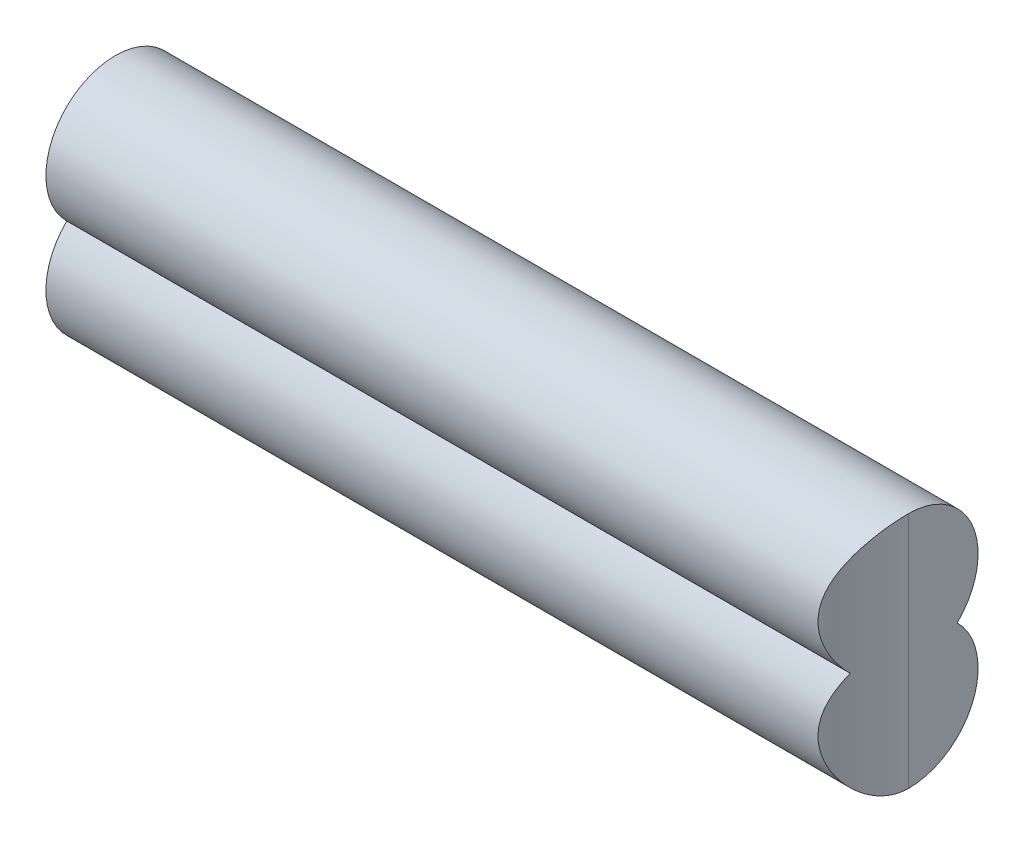
ISO-10303-21;
HEADER;
FILE_DESCRIPTION(('STEP AP214'),'2;1');
FILE_NAME('part.step','',(''),(''),'','','');
FILE_SCHEMA(('AUTOMOTIVE_DESIGN { 1 0 10303 214 1 1 1 1 }'));
ENDSEC;
DATA;
#1=APPLICATION_CONTEXT('core data for automotive mechanical design processes');
#2=APPLICATION_PROTOCOL_DEFINITION('international standard','automotive_design',2000,#1);
#3=PRODUCT_CONTEXT('',#1,'mechanical');
#4=PRODUCT('Part','Part','',(#3));
#5=PRODUCT_RELATED_PRODUCT_CATEGORY('part','',(#4));
#6=PRODUCT_DEFINITION_FORMATION('','',#4);
#7=PRODUCT_DEFINITION_CONTEXT('part definition',#1,'design');
#8=PRODUCT_DEFINITION('design','',#6,#7);
#9=PRODUCT_DEFINITION_SHAPE('','',#8);
#10=(LENGTH_UNIT() NAMED_UNIT(*) SI_UNIT(.MILLI.,.METRE.));
#11=(NAMED_UNIT(*) PLANE_ANGLE_UNIT() SI_UNIT($,.RADIAN.));
#12=(NAMED_UNIT(*) SI_UNIT($,.STERADIAN.) SOLID_ANGLE_UNIT());
#13=UNCERTAINTY_MEASURE_WITH_UNIT(LENGTH_MEASURE(1.E-05),#10,'distance_accuracy_value','');
#14=(GEOMETRIC_REPRESENTATION_CONTEXT(3) GLOBAL_UNCERTAINTY_ASSIGNED_CONTEXT((#13)) GLOBAL_UNIT_ASSIGNED_CONTEXT((#10,
#11,#12)) REPRESENTATION_CONTEXT('',''));
#15=CARTESIAN_POINT('',(0.,0.,0.));
#16=DIRECTION('',(0.,0.,1.));
#17=DIRECTION('',(1.,0.,0.));
#18=AXIS2_PLACEMENT_3D('',#15,#16,#17);
#19=CARTESIAN_POINT('',(34.29,0.,0.));
#20=DIRECTION('',(0.,-1.,0.));
#21=DIRECTION('',(0.,0.,-1.));
#22=AXIS2_PLACEMENT_3D('',#19,#20,#21);
#23=CYLINDRICAL_SURFACE('',#22,6.35);
#24=DIRECTION('',(0.,-1.,0.));
#25=VECTOR('',#24,1.);
#26=CARTESIAN_POINT('',(40.64,0.,0.));
#27=LINE('',#26,#25);
#28=CARTESIAN_POINT('',(40.64,6.096,0.));
#29=VERTEX_POINT('',#28);
#30=CARTESIAN_POINT('',(40.64,-6.096,0.));
#31=VERTEX_POINT('',#30);
#32=EDGE_CURVE('E83',#29,#31,#27,.T.);
#33=ORIENTED_EDGE('',*,*,#32,.F.);
#34=CARTESIAN_POINT('',(40.64,6.096,0.));
#35=CARTESIAN_POINT('',(40.6400177633631,6.09601602648992,0.0924464032177822));
#36=CARTESIAN_POINT('',(40.6379816723451,6.09239545148593,0.184881129904971));
#37=CARTESIAN_POINT('',(40.6299354813112,6.07800550124952,0.368976576731337));
#38=CARTESIAN_POINT('',(40.6239272262755,6.06723944492211,0.46063763621286));
#39=CARTESIAN_POINT('',(40.6081108993355,6.03875605802071,0.642055141653491));
#40=CARTESIAN_POINT('',(40.5983225020261,6.02107471363468,0.731818951888273));
#41=CARTESIAN_POINT('',(40.5752004567642,5.97899497624933,0.909271992838492));
#42=CARTESIAN_POINT('',(40.5618665436802,5.95459608091059,0.996961067872186));
#43=CARTESIAN_POINT('',(40.5170408479647,5.87179587398613,1.2557773521343));
#44=CARTESIAN_POINT('',(40.4806852860298,5.8037218327111,1.42308511201327));
#45=CARTESIAN_POINT('',(40.3981724984739,5.6443584721183,1.74363203096434));
#46=CARTESIAN_POINT('',(40.3520042948353,5.55304312851054,1.89685515533427));
#47=CARTESIAN_POINT('',(40.2501300891021,5.34265111242116,2.19684675795752));
#48=CARTESIAN_POINT('',(40.1939832469459,5.22208142095282,2.34241787695422));
#49=CARTESIAN_POINT('',(40.0795905364117,4.95989974592775,2.61241130880186));
#50=CARTESIAN_POINT('',(40.0213427209364,4.81826784240716,2.73681335917221));
#51=CARTESIAN_POINT('',(39.9022557073748,4.50059804442045,2.97396073436659));
#52=CARTESIAN_POINT('',(39.8417716712645,4.3225166468084,3.08416931434248));
#53=CARTESIAN_POINT('',(39.7328428698641,3.94685532344016,3.27259486663701));
#54=CARTESIAN_POINT('',(39.6843804743601,3.74930455200181,3.35085879716356));
#55=CARTESIAN_POINT('',(39.6157696868679,3.38349903076697,3.45859100819858));
#56=CARTESIAN_POINT('',(39.5917872608493,3.21798011547501,3.49490571856329));
#57=CARTESIAN_POINT('',(39.5593932813987,2.88202099488082,3.54357010094295));
#58=CARTESIAN_POINT('',(39.550966170934,2.71158587981936,3.55594371729235));
#59=CARTESIAN_POINT('',(39.5508901450036,2.37051007659121,3.55605597793802));
#60=CARTESIAN_POINT('',(39.559260978042,2.19986938244442,3.54376562603699));
#61=CARTESIAN_POINT('',(39.5915921638771,1.86352831783626,3.49520189820458));
#62=CARTESIAN_POINT('',(39.6155623456229,1.69783113110454,3.45891340111705));
#63=CARTESIAN_POINT('',(39.6759178985133,1.37559145886848,3.36414977116974));
#64=CARTESIAN_POINT('',(39.712291540666,1.21904048771839,3.30569559285018));
#65=CARTESIAN_POINT('',(39.7935489164858,0.917401505572996,3.16856191538067));
#66=CARTESIAN_POINT('',(39.8384376466452,0.772320295987464,3.08987053172965));
#67=CARTESIAN_POINT('',(39.9249724652222,0.518266699524757,2.92856882425006));
#68=CARTESIAN_POINT('',(39.9659379068547,0.407279701126989,2.8487309221066));
#69=CARTESIAN_POINT('',(40.0487815924903,0.195739771945045,2.6773155638549));
#70=CARTESIAN_POINT('',(40.0906567630757,0.0951568221711245,2.58577368947771));
#71=CARTESIAN_POINT('',(40.132,0.,2.48868157866771));
#72=B_SPLINE_CURVE_WITH_KNOTS('',3,(#34,#35,#36,#37,#38,#39,#40,#41,#42,#43,#44,#45,#46,#47,#48,
#49,#50,#51,#52,#53,#54,#55,#56,#57,#58,#59,#60,#61,#62,#63,#64,#65,#66,#67,#68,#69,#70,#71),
.UNSPECIFIED.,.F.,.F.,(4,2,2,2,2,2,2,2,2,2,2,2,2,2,2,2,2,2,4),(0.,0.277226622815061,
0.554324570529614,0.829999325485477,1.10569470104003,1.65578571865716,2.2064954278648,
2.79565091961426,3.38536720175046,4.03608203157778,4.68583684416059,5.19703760661564,
5.70772683429968,6.21901680556949,6.73062924639551,7.24175923040972,7.75319006879544,
8.18051889060818,8.60657816048486),.UNSPECIFIED.);
#73=CARTESIAN_POINT('',(40.132,0.,2.48868157866771));
#74=VERTEX_POINT('',#73);
#75=EDGE_CURVE('E11',#29,#74,#72,.T.);
#76=ORIENTED_EDGE('',*,*,#75,.T.);
#77=CARTESIAN_POINT('',(40.132,0.,2.48868157866771));
#78=CARTESIAN_POINT('',(40.101933774365,-0.0691690345372795,2.55926489642416));
#79=CARTESIAN_POINT('',(40.0716116681381,-0.141182285868921,2.62688862819314));
#80=CARTESIAN_POINT('',(40.0112014371527,-0.290672562935471,2.75598148606298));
#81=CARTESIAN_POINT('',(39.9811134076596,-0.368151696004347,2.81744821602728));
#82=CARTESIAN_POINT('',(39.8919145764182,-0.609560421183805,2.99304893771906));
#83=CARTESIAN_POINT('',(39.8343401434445,-0.781422824440674,3.09732229140374));
#84=CARTESIAN_POINT('',(39.7302543010302,-1.14392062795044,3.27674123111495));
#85=CARTESIAN_POINT('',(39.6837838177889,-1.33462192295759,3.35177968651386));
#86=CARTESIAN_POINT('',(39.6281412097213,-1.63017853323563,3.43917300125444));
#87=CARTESIAN_POINT('',(39.6119508267472,-1.73013017251421,3.46409210354271));
#88=CARTESIAN_POINT('',(39.5849355910822,-1.9325409261751,3.50524952916509));
#89=CARTESIAN_POINT('',(39.5741097047465,-2.03499955350898,3.52148952485874));
#90=CARTESIAN_POINT('',(39.5593036248031,-2.22939214224146,3.54359864123554));
#91=CARTESIAN_POINT('',(39.554674387651,-2.32116639528988,3.55045319702886));
#92=CARTESIAN_POINT('',(39.550240123571,-2.50512223448104,3.55701995031027));
#93=CARTESIAN_POINT('',(39.5504366795106,-2.59730394435764,3.55672980432535));
#94=CARTESIAN_POINT('',(39.5556541690825,-2.78124680846357,3.54900108330513));
#95=CARTESIAN_POINT('',(39.5606759137523,-2.87300788938655,3.54156130653037));
#96=CARTESIAN_POINT('',(39.5753238550646,-3.05532879298999,3.51966159635987));
#97=CARTESIAN_POINT('',(39.584951885351,-3.14588812251704,3.50519886727283));
#98=CARTESIAN_POINT('',(39.6180178074093,-3.39806813000921,3.45489134580069));
#99=CARTESIAN_POINT('',(39.6463183315489,-3.55756540786387,3.41122345754105));
#100=CARTESIAN_POINT('',(39.7135609899766,-3.86686249719756,3.30325357564433));
#101=CARTESIAN_POINT('',(39.7525051834159,-4.01666042527251,3.23894758888858));
#102=CARTESIAN_POINT('',(39.842284953297,-4.32162306657544,3.0828002728238));
#103=CARTESIAN_POINT('',(39.8939823041824,-4.4753257757057,2.9886012673088));
#104=CARTESIAN_POINT('',(40.0009079642684,-4.76607853555058,2.7788295484032));
#105=CARTESIAN_POINT('',(40.056138949736,-4.90311573091219,2.66324050642076));
#106=CARTESIAN_POINT('',(40.1734129847209,-5.17717311253631,2.39426231051528));
#107=CARTESIAN_POINT('',(40.235278344487,-5.31129147325697,2.23782047326079));
#108=CARTESIAN_POINT('',(40.3510815293754,-5.55171997641906,1.90190445893798));
#109=CARTESIAN_POINT('',(40.4050171456464,-5.65802237705594,1.72242389034862));
#110=CARTESIAN_POINT('',(40.4751087598381,-5.7926316959589,1.44088506812198));
#111=CARTESIAN_POINT('',(40.4965398909089,-5.83313089568061,1.3458018635316));
#112=CARTESIAN_POINT('',(40.5354521901426,-5.90589686952458,1.1517756114906));
#113=CARTESIAN_POINT('',(40.5529355171526,-5.93816814432068,1.05283470849781));
#114=CARTESIAN_POINT('',(40.5833893345971,-5.9939729657311,0.852081623905526));
#115=CARTESIAN_POINT('',(40.5963695298548,-6.01752531019884,0.750276134639731));
#116=CARTESIAN_POINT('',(40.6174512810027,-6.05561220293911,0.544548850383959));
#117=CARTESIAN_POINT('',(40.6255565267599,-6.07015357190489,0.440628717727971));
#118=CARTESIAN_POINT('',(40.6340567965544,-6.08537866356599,0.280317825911962));
#119=CARTESIAN_POINT('',(40.6362845794672,-6.08936210569691,0.224314191220935));
#120=CARTESIAN_POINT('',(40.639256027483,-6.09467162935755,0.112210242858447));
#121=CARTESIAN_POINT('',(40.6400014942568,-6.09600093684488,0.0561101296024767));
#122=CARTESIAN_POINT('',(40.64,-6.096,0.));
#123=B_SPLINE_CURVE_WITH_KNOTS('',3,(#77,#78,#79,#80,#81,#82,#83,#84,#85,#86,#87,#88,#89,#90,
#91,#92,#93,#94,#95,#96,#97,#98,#99,#100,#101,#102,#103,#104,#105,#106,#107,#108,#109,#110,#111,
#112,#113,#114,#115,#116,#117,#118,#119,#120,#121,#122),.UNSPECIFIED.,.F.,.F.,(4,2,2,2,2,2,2,2,
2,2,2,2,2,2,2,2,2,2,2,2,2,2,4),(0.,0.309723118261079,0.619566307758106,1.24387174510484,
1.87044388814638,2.18282796318386,2.49515182384185,2.77120168788554,3.047342097909,
3.32352893087185,3.59982579831245,4.10089469584935,4.60206060014425,5.16252258304053,
5.72341418615086,6.36589075587333,7.00854595147121,7.32480513372029,7.64089094928742,
7.95629126504312,8.27145255174197,8.43994745349603,8.60823743380485),.UNSPECIFIED.);
#124=EDGE_CURVE('E45',#74,#31,#123,.T.);
#125=ORIENTED_EDGE('',*,*,#124,.T.);
#126=EDGE_LOOP('',(#33,#76,#125));
#127=FACE_BOUND('',#126,.T.);
#128=ADVANCED_FACE('F32',(#127),#23,.T.);
#129=CARTESIAN_POINT('',(40.64,0.,0.));
#130=DIRECTION('',(-1.,0.,0.));
#131=DIRECTION('',(0.,0.,1.));
#132=AXIS2_PLACEMENT_3D('',#129,#130,#131);
#133=PLANE('',#132);
#134=CARTESIAN_POINT('',(40.64,2.54,0.));
#135=DIRECTION('',(-1.,0.,0.));
#136=DIRECTION('',(0.,0.,1.));
#137=AXIS2_PLACEMENT_3D('',#134,#135,#136);
#138=CIRCLE('',#137,3.556);
#139=CARTESIAN_POINT('',(40.64,0.,-2.48868157866771));
#140=VERTEX_POINT('',#139);
#141=EDGE_CURVE('E73',#29,#140,#138,.T.);
#142=ORIENTED_EDGE('',*,*,#141,.F.);
#143=ORIENTED_EDGE('',*,*,#32,.T.);
#144=CARTESIAN_POINT('',(40.64,-2.54,0.));
#145=DIRECTION('',(-1.,0.,0.));
#146=DIRECTION('',(0.,0.,1.));
#147=AXIS2_PLACEMENT_3D('',#144,#145,#146);
#148=CIRCLE('',#147,3.556);
#149=EDGE_CURVE('E60',#140,#31,#148,.T.);
#150=ORIENTED_EDGE('',*,*,#149,.F.);
#151=EDGE_LOOP('',(#142,#143,#150));
#152=FACE_BOUND('',#151,.T.);
#153=ADVANCED_FACE('F86',(#152),#133,.F.);
#154=CARTESIAN_POINT('',(40.64,2.54,0.));
#155=DIRECTION('',(-1.,0.,0.));
#156=DIRECTION('',(0.,0.,1.));
#157=AXIS2_PLACEMENT_3D('',#154,#155,#156);
#158=CYLINDRICAL_SURFACE('',#157,3.556);
#159=ORIENTED_EDGE('',*,*,#141,.T.);
#160=DIRECTION('',(-1.,0.,0.));
#161=VECTOR('',#160,1.);
#162=CARTESIAN_POINT('',(40.64,0.,-2.48868157866771));
#163=LINE('',#162,#161);
#164=CARTESIAN_POINT('',(0.,0.,-2.48868157866771));
#165=VERTEX_POINT('',#164);
#166=EDGE_CURVE('E75',#140,#165,#163,.T.);
#167=ORIENTED_EDGE('',*,*,#166,.T.);
#168=CARTESIAN_POINT('',(0.,2.54,0.));
#169=DIRECTION('',(-1.,0.,0.));
#170=DIRECTION('',(0.,0.,1.));
#171=AXIS2_PLACEMENT_3D('',#168,#169,#170);
#172=CIRCLE('',#171,3.556);
#173=CARTESIAN_POINT('',(0.,0.,2.48868157866771));
#174=VERTEX_POINT('',#173);
#175=EDGE_CURVE('E52',#174,#165,#172,.T.);
#176=ORIENTED_EDGE('',*,*,#175,.F.);
#177=DIRECTION('',(-1.,0.,0.));
#178=VECTOR('',#177,1.);
#179=CARTESIAN_POINT('',(40.64,0.,2.48868157866771));
#180=LINE('',#179,#178);
#181=EDGE_CURVE('E84',#74,#174,#180,.T.);
#182=ORIENTED_EDGE('',*,*,#181,.F.);
#183=ORIENTED_EDGE('',*,*,#75,.F.);
#184=EDGE_LOOP('',(#159,#167,#176,#182,#183));
#185=FACE_BOUND('',#184,.T.);
#186=ADVANCED_FACE('F74',(#185),#158,.T.);
#187=CARTESIAN_POINT('',(40.64,-2.54,0.));
#188=DIRECTION('',(-1.,0.,0.));
#189=DIRECTION('',(0.,0.,1.));
#190=AXIS2_PLACEMENT_3D('',#187,#188,#189);
#191=CYLINDRICAL_SURFACE('',#190,3.556);
#192=ORIENTED_EDGE('',*,*,#181,.T.);
#193=CARTESIAN_POINT('',(0.,-2.54,0.));
#194=DIRECTION('',(-1.,0.,0.));
#195=DIRECTION('',(0.,0.,1.));
#196=AXIS2_PLACEMENT_3D('',#193,#194,#195);
#197=CIRCLE('',#196,3.556);
#198=EDGE_CURVE('E79',#165,#174,#197,.T.);
#199=ORIENTED_EDGE('',*,*,#198,.F.);
#200=ORIENTED_EDGE('',*,*,#166,.F.);
#201=ORIENTED_EDGE('',*,*,#149,.T.);
#202=ORIENTED_EDGE('',*,*,#124,.F.);
#203=EDGE_LOOP('',(#192,#199,#200,#201,#202));
#204=FACE_BOUND('',#203,.T.);
#205=ADVANCED_FACE('F81',(#204),#191,.T.);
#206=CARTESIAN_POINT('',(0.,0.,0.));
#207=DIRECTION('',(-1.,0.,0.));
#208=DIRECTION('',(0.,0.,1.));
#209=AXIS2_PLACEMENT_3D('',#206,#207,#208);
#210=PLANE('',#209);
#211=ORIENTED_EDGE('',*,*,#198,.T.);
#212=ORIENTED_EDGE('',*,*,#175,.T.);
#213=EDGE_LOOP('',(#211,#212));
#214=FACE_BOUND('',#213,.T.);
#215=ADVANCED_FACE('F99',(#214),#210,.T.);
#216=CLOSED_SHELL('',(#128,#153,#186,#205,#215));
#217=MANIFOLD_SOLID_BREP('B2',#216);
#218=ADVANCED_BREP_SHAPE_REPRESENTATION('',(#18,#217),#14);
#219=SHAPE_DEFINITION_REPRESENTATION(#9,#218);
ENDSEC;
END-ISO-10303-21;
